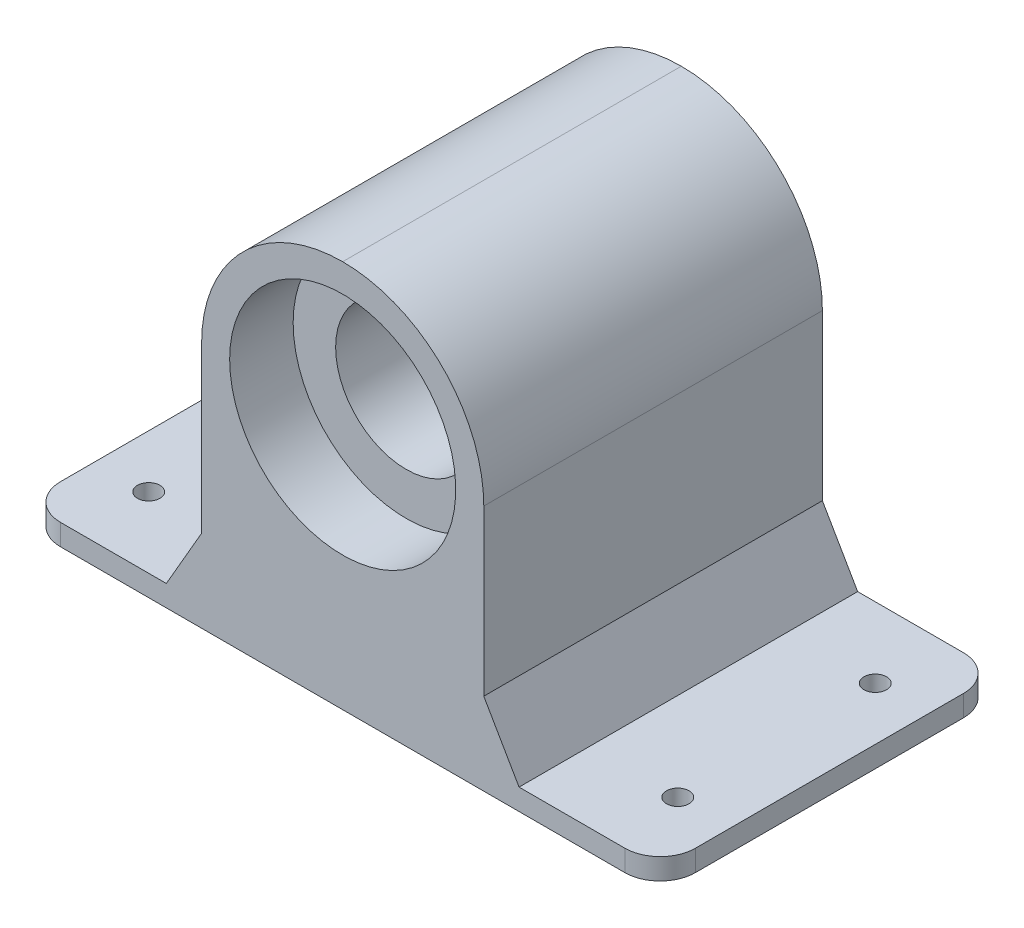
ISO-10303-21;
HEADER;
FILE_DESCRIPTION(('STEP AP214'),'2;1');
FILE_NAME('part.step','',(''),(''),'','','');
FILE_SCHEMA(('AUTOMOTIVE_DESIGN { 1 0 10303 214 1 1 1 1 }'));
ENDSEC;
DATA;
#1=APPLICATION_CONTEXT('core data for automotive mechanical design processes');
#2=APPLICATION_PROTOCOL_DEFINITION('international standard','automotive_design',2000,#1);
#3=PRODUCT_CONTEXT('',#1,'mechanical');
#4=PRODUCT('Part','Part','',(#3));
#5=PRODUCT_RELATED_PRODUCT_CATEGORY('part','',(#4));
#6=PRODUCT_DEFINITION_FORMATION('','',#4);
#7=PRODUCT_DEFINITION_CONTEXT('part definition',#1,'design');
#8=PRODUCT_DEFINITION('design','',#6,#7);
#9=PRODUCT_DEFINITION_SHAPE('','',#8);
#10=(LENGTH_UNIT() NAMED_UNIT(*) SI_UNIT(.MILLI.,.METRE.));
#11=(NAMED_UNIT(*) PLANE_ANGLE_UNIT() SI_UNIT($,.RADIAN.));
#12=(NAMED_UNIT(*) SI_UNIT($,.STERADIAN.) SOLID_ANGLE_UNIT());
#13=UNCERTAINTY_MEASURE_WITH_UNIT(LENGTH_MEASURE(1.E-05),#10,'distance_accuracy_value','');
#14=(GEOMETRIC_REPRESENTATION_CONTEXT(3) GLOBAL_UNCERTAINTY_ASSIGNED_CONTEXT((#13)) GLOBAL_UNIT_ASSIGNED_CONTEXT((#10,
#11,#12)) REPRESENTATION_CONTEXT('',''));
#15=CARTESIAN_POINT('',(0.,0.,0.));
#16=DIRECTION('',(0.,0.,1.));
#17=DIRECTION('',(1.,0.,0.));
#18=AXIS2_PLACEMENT_3D('',#15,#16,#17);
#19=CARTESIAN_POINT('',(20.,0.,24.));
#20=DIRECTION('',(-1.,0.,0.));
#21=DIRECTION('',(0.,0.,1.));
#22=AXIS2_PLACEMENT_3D('',#19,#20,#21);
#23=PLANE('',#22);
#24=DIRECTION('',(0.,1.,0.));
#25=VECTOR('',#24,1.);
#26=CARTESIAN_POINT('',(20.,0.,-24.));
#27=LINE('',#26,#25);
#28=CARTESIAN_POINT('',(20.,-23.3397459621555,-24.));
#29=VERTEX_POINT('',#28);
#30=CARTESIAN_POINT('',(20.,0.,-24.));
#31=VERTEX_POINT('',#30);
#32=EDGE_CURVE('E297',#29,#31,#27,.T.);
#33=ORIENTED_EDGE('',*,*,#32,.T.);
#34=DIRECTION('',(0.,0.,-1.));
#35=VECTOR('',#34,1.);
#36=CARTESIAN_POINT('',(20.,0.,24.));
#37=LINE('',#36,#35);
#38=CARTESIAN_POINT('',(20.,0.,24.));
#39=VERTEX_POINT('',#38);
#40=EDGE_CURVE('E208',#31,#39,#37,.F.);
#41=ORIENTED_EDGE('',*,*,#40,.T.);
#42=DIRECTION('',(0.,1.,0.));
#43=VECTOR('',#42,1.);
#44=CARTESIAN_POINT('',(20.,-35.,24.));
#45=LINE('',#44,#43);
#46=CARTESIAN_POINT('',(20.,-23.3397459621555,24.));
#47=VERTEX_POINT('',#46);
#48=EDGE_CURVE('E169',#47,#39,#45,.T.);
#49=ORIENTED_EDGE('',*,*,#48,.F.);
#50=DIRECTION('',(0.,0.,-1.));
#51=VECTOR('',#50,1.);
#52=CARTESIAN_POINT('',(20.,-23.3397459621555,-24.));
#53=LINE('',#52,#51);
#54=EDGE_CURVE('E182',#47,#29,#53,.T.);
#55=ORIENTED_EDGE('',*,*,#54,.T.);
#56=EDGE_LOOP('',(#33,#41,#49,#55));
#57=FACE_BOUND('',#56,.T.);
#58=ADVANCED_FACE('F34',(#57),#23,.F.);
#59=CARTESIAN_POINT('',(0.,0.,24.));
#60=DIRECTION('',(0.,0.,-1.));
#61=DIRECTION('',(-1.,0.,0.));
#62=AXIS2_PLACEMENT_3D('',#59,#60,#61);
#63=CYLINDRICAL_SURFACE('',#62,10.);
#64=CARTESIAN_POINT('',(0.,0.,-15.));
#65=DIRECTION('',(0.,0.,-1.));
#66=DIRECTION('',(-1.,0.,0.));
#67=AXIS2_PLACEMENT_3D('',#64,#65,#66);
#68=CIRCLE('',#67,10.);
#69=CARTESIAN_POINT('',(-10.,0.,-15.));
#70=VERTEX_POINT('',#69);
#71=EDGE_CURVE('E151',#70,#70,#68,.T.);
#72=ORIENTED_EDGE('',*,*,#71,.T.);
#73=EDGE_LOOP('',(#72));
#74=FACE_BOUND('',#73,.T.);
#75=CARTESIAN_POINT('',(0.,0.,15.));
#76=DIRECTION('',(0.,0.,1.));
#77=DIRECTION('',(1.,0.,0.));
#78=AXIS2_PLACEMENT_3D('',#75,#76,#77);
#79=CIRCLE('',#78,10.);
#80=CARTESIAN_POINT('',(10.,0.,15.));
#81=VERTEX_POINT('',#80);
#82=EDGE_CURVE('E177',#81,#81,#79,.T.);
#83=ORIENTED_EDGE('',*,*,#82,.T.);
#84=EDGE_LOOP('',(#83));
#85=FACE_BOUND('',#84,.T.);
#86=ADVANCED_FACE('F305',(#74,#85),#63,.F.);
#87=CARTESIAN_POINT('',(0.,0.,24.));
#88=DIRECTION('',(0.,0.,1.));
#89=DIRECTION('',(1.,0.,0.));
#90=AXIS2_PLACEMENT_3D('',#87,#88,#89);
#91=PLANE('',#90);
#92=CARTESIAN_POINT('',(0.,0.,24.));
#93=DIRECTION('',(0.,0.,-1.));
#94=DIRECTION('',(-1.,0.,0.));
#95=AXIS2_PLACEMENT_3D('',#92,#93,#94);
#96=CIRCLE('',#95,16.025);
#97=CARTESIAN_POINT('',(-16.025,0.,24.));
#98=VERTEX_POINT('',#97);
#99=EDGE_CURVE('E283',#98,#98,#96,.T.);
#100=ORIENTED_EDGE('',*,*,#99,.T.);
#101=EDGE_LOOP('',(#100));
#102=FACE_BOUND('',#101,.T.);
#103=DIRECTION('',(1.,0.,0.));
#104=VECTOR('',#103,1.);
#105=CARTESIAN_POINT('',(-20.,-35.,24.));
#106=LINE('',#105,#104);
#107=CARTESIAN_POINT('',(-40.,-35.,24.));
#108=VERTEX_POINT('',#107);
#109=CARTESIAN_POINT('',(40.,-35.,24.));
#110=VERTEX_POINT('',#109);
#111=EDGE_CURVE('E174',#108,#110,#106,.T.);
#112=ORIENTED_EDGE('',*,*,#111,.T.);
#113=DIRECTION('',(0.,-1.,0.));
#114=VECTOR('',#113,1.);
#115=CARTESIAN_POINT('',(40.,-32.,24.));
#116=LINE('',#115,#114);
#117=CARTESIAN_POINT('',(40.,-32.,24.));
#118=VERTEX_POINT('',#117);
#119=EDGE_CURVE('E237',#110,#118,#116,.F.);
#120=ORIENTED_EDGE('',*,*,#119,.T.);
#121=DIRECTION('',(-1.,0.,0.));
#122=VECTOR('',#121,1.);
#123=CARTESIAN_POINT('',(45.,-32.,24.));
#124=LINE('',#123,#122);
#125=CARTESIAN_POINT('',(25.,-32.,24.));
#126=VERTEX_POINT('',#125);
#127=EDGE_CURVE('E279',#118,#126,#124,.T.);
#128=ORIENTED_EDGE('',*,*,#127,.T.);
#129=DIRECTION('',(0.499999999999994,-0.866025403784442,0.));
#130=VECTOR('',#129,1.);
#131=CARTESIAN_POINT('',(25.,-32.,24.));
#132=LINE('',#131,#130);
#133=EDGE_CURVE('E162',#126,#47,#132,.F.);
#134=ORIENTED_EDGE('',*,*,#133,.T.);
#135=ORIENTED_EDGE('',*,*,#48,.T.);
#136=CARTESIAN_POINT('',(0.,0.,24.));
#137=DIRECTION('',(0.,0.,1.));
#138=DIRECTION('',(1.,0.,0.));
#139=AXIS2_PLACEMENT_3D('',#136,#137,#138);
#140=CIRCLE('',#139,20.);
#141=CARTESIAN_POINT('',(0.,20.,24.));
#142=VERTEX_POINT('',#141);
#143=EDGE_CURVE('E213',#39,#142,#140,.T.);
#144=ORIENTED_EDGE('',*,*,#143,.T.);
#145=CARTESIAN_POINT('',(0.,0.,24.));
#146=DIRECTION('',(0.,0.,1.));
#147=DIRECTION('',(1.,0.,0.));
#148=AXIS2_PLACEMENT_3D('',#145,#146,#147);
#149=CIRCLE('',#148,20.);
#150=CARTESIAN_POINT('',(-20.,0.,24.));
#151=VERTEX_POINT('',#150);
#152=EDGE_CURVE('E211',#142,#151,#149,.T.);
#153=ORIENTED_EDGE('',*,*,#152,.T.);
#154=DIRECTION('',(0.,-1.,0.));
#155=VECTOR('',#154,1.);
#156=CARTESIAN_POINT('',(-20.,0.,24.));
#157=LINE('',#156,#155);
#158=CARTESIAN_POINT('',(-20.,-23.3397459621555,24.));
#159=VERTEX_POINT('',#158);
#160=EDGE_CURVE('E295',#151,#159,#157,.T.);
#161=ORIENTED_EDGE('',*,*,#160,.T.);
#162=DIRECTION('',(-0.499999999999994,-0.866025403784442,0.));
#163=VECTOR('',#162,1.);
#164=CARTESIAN_POINT('',(-20.,-23.3397459621555,24.));
#165=LINE('',#164,#163);
#166=CARTESIAN_POINT('',(-25.,-32.,24.));
#167=VERTEX_POINT('',#166);
#168=EDGE_CURVE('E163',#159,#167,#165,.T.);
#169=ORIENTED_EDGE('',*,*,#168,.T.);
#170=DIRECTION('',(1.,0.,0.));
#171=VECTOR('',#170,1.);
#172=CARTESIAN_POINT('',(-45.,-32.,24.));
#173=LINE('',#172,#171);
#174=CARTESIAN_POINT('',(-40.,-32.,24.));
#175=VERTEX_POINT('',#174);
#176=EDGE_CURVE('E252',#175,#167,#173,.T.);
#177=ORIENTED_EDGE('',*,*,#176,.F.);
#178=DIRECTION('',(0.,-1.,0.));
#179=VECTOR('',#178,1.);
#180=CARTESIAN_POINT('',(-40.,-35.,24.));
#181=LINE('',#180,#179);
#182=EDGE_CURVE('E234',#175,#108,#181,.T.);
#183=ORIENTED_EDGE('',*,*,#182,.T.);
#184=EDGE_LOOP('',(#112,#120,#128,#134,#135,#144,#153,#161,#169,#177,#183));
#185=FACE_BOUND('',#184,.T.);
#186=ADVANCED_FACE('F257',(#102,#185),#91,.T.);
#187=CARTESIAN_POINT('',(0.,0.,-24.));
#188=DIRECTION('',(0.,0.,1.));
#189=DIRECTION('',(1.,0.,0.));
#190=AXIS2_PLACEMENT_3D('',#187,#188,#189);
#191=PLANE('',#190);
#192=CARTESIAN_POINT('',(0.,0.,-24.));
#193=DIRECTION('',(0.,0.,-1.));
#194=DIRECTION('',(-1.,0.,0.));
#195=AXIS2_PLACEMENT_3D('',#192,#193,#194);
#196=CIRCLE('',#195,16.025);
#197=CARTESIAN_POINT('',(-16.025,0.,-24.));
#198=VERTEX_POINT('',#197);
#199=EDGE_CURVE('E292',#198,#198,#196,.T.);
#200=ORIENTED_EDGE('',*,*,#199,.F.);
#201=EDGE_LOOP('',(#200));
#202=FACE_BOUND('',#201,.T.);
#203=DIRECTION('',(-1.,0.,0.));
#204=VECTOR('',#203,1.);
#205=CARTESIAN_POINT('',(45.,-32.,-24.));
#206=LINE('',#205,#204);
#207=CARTESIAN_POINT('',(40.,-32.,-24.));
#208=VERTEX_POINT('',#207);
#209=CARTESIAN_POINT('',(25.,-32.,-24.));
#210=VERTEX_POINT('',#209);
#211=EDGE_CURVE('E281',#208,#210,#206,.T.);
#212=ORIENTED_EDGE('',*,*,#211,.F.);
#213=DIRECTION('',(0.,1.,0.));
#214=VECTOR('',#213,1.);
#215=CARTESIAN_POINT('',(40.,0.,-24.));
#216=LINE('',#215,#214);
#217=CARTESIAN_POINT('',(40.,-35.,-24.));
#218=VERTEX_POINT('',#217);
#219=EDGE_CURVE('E245',#208,#218,#216,.F.);
#220=ORIENTED_EDGE('',*,*,#219,.T.);
#221=DIRECTION('',(1.,0.,0.));
#222=VECTOR('',#221,1.);
#223=CARTESIAN_POINT('',(-20.,-35.,-24.));
#224=LINE('',#223,#222);
#225=CARTESIAN_POINT('',(-40.,-35.,-24.));
#226=VERTEX_POINT('',#225);
#227=EDGE_CURVE('E150',#226,#218,#224,.T.);
#228=ORIENTED_EDGE('',*,*,#227,.F.);
#229=DIRECTION('',(0.,1.,0.));
#230=VECTOR('',#229,1.);
#231=CARTESIAN_POINT('',(-40.,0.,-24.));
#232=LINE('',#231,#230);
#233=CARTESIAN_POINT('',(-40.,-32.,-24.));
#234=VERTEX_POINT('',#233);
#235=EDGE_CURVE('E243',#226,#234,#232,.T.);
#236=ORIENTED_EDGE('',*,*,#235,.T.);
#237=DIRECTION('',(1.,0.,0.));
#238=VECTOR('',#237,1.);
#239=CARTESIAN_POINT('',(-45.,-32.,-24.));
#240=LINE('',#239,#238);
#241=CARTESIAN_POINT('',(-25.,-32.,-24.));
#242=VERTEX_POINT('',#241);
#243=EDGE_CURVE('E158',#234,#242,#240,.T.);
#244=ORIENTED_EDGE('',*,*,#243,.T.);
#245=DIRECTION('',(0.499999999999994,0.866025403784442,0.));
#246=VECTOR('',#245,1.);
#247=CARTESIAN_POINT('',(-4.89359353944923,2.82531754730558,-24.));
#248=LINE('',#247,#246);
#249=CARTESIAN_POINT('',(-20.,-23.3397459621555,-24.));
#250=VERTEX_POINT('',#249);
#251=EDGE_CURVE('E154',#242,#250,#248,.T.);
#252=ORIENTED_EDGE('',*,*,#251,.T.);
#253=DIRECTION('',(0.,-1.,0.));
#254=VECTOR('',#253,1.);
#255=CARTESIAN_POINT('',(-20.,-35.,-24.));
#256=LINE('',#255,#254);
#257=CARTESIAN_POINT('',(-20.,0.,-24.));
#258=VERTEX_POINT('',#257);
#259=EDGE_CURVE('E140',#258,#250,#256,.T.);
#260=ORIENTED_EDGE('',*,*,#259,.F.);
#261=CARTESIAN_POINT('',(0.,0.,-24.));
#262=DIRECTION('',(0.,0.,1.));
#263=DIRECTION('',(1.,0.,0.));
#264=AXIS2_PLACEMENT_3D('',#261,#262,#263);
#265=CIRCLE('',#264,20.);
#266=CARTESIAN_POINT('',(0.,20.,-24.));
#267=VERTEX_POINT('',#266);
#268=EDGE_CURVE('E189',#258,#267,#265,.F.);
#269=ORIENTED_EDGE('',*,*,#268,.T.);
#270=CARTESIAN_POINT('',(0.,0.,-24.));
#271=DIRECTION('',(0.,0.,1.));
#272=DIRECTION('',(1.,0.,0.));
#273=AXIS2_PLACEMENT_3D('',#270,#271,#272);
#274=CIRCLE('',#273,20.);
#275=EDGE_CURVE('E206',#267,#31,#274,.F.);
#276=ORIENTED_EDGE('',*,*,#275,.T.);
#277=ORIENTED_EDGE('',*,*,#32,.F.);
#278=DIRECTION('',(-0.499999999999994,0.866025403784442,0.));
#279=VECTOR('',#278,1.);
#280=CARTESIAN_POINT('',(4.89359353944923,2.82531754730558,-24.));
#281=LINE('',#280,#279);
#282=EDGE_CURVE('E186',#29,#210,#281,.F.);
#283=ORIENTED_EDGE('',*,*,#282,.T.);
#284=EDGE_LOOP('',(#212,#220,#228,#236,#244,#252,#260,#269,#276,#277,#283));
#285=FACE_BOUND('',#284,.T.);
#286=ADVANCED_FACE('F156',(#202,#285),#191,.F.);
#287=CARTESIAN_POINT('',(-20.,-35.,24.));
#288=DIRECTION('',(1.,0.,0.));
#289=DIRECTION('',(0.,0.,-1.));
#290=AXIS2_PLACEMENT_3D('',#287,#288,#289);
#291=PLANE('',#290);
#292=ORIENTED_EDGE('',*,*,#160,.F.);
#293=DIRECTION('',(0.,0.,-1.));
#294=VECTOR('',#293,1.);
#295=CARTESIAN_POINT('',(-20.,0.,24.));
#296=LINE('',#295,#294);
#297=EDGE_CURVE('E147',#151,#258,#296,.T.);
#298=ORIENTED_EDGE('',*,*,#297,.T.);
#299=ORIENTED_EDGE('',*,*,#259,.T.);
#300=DIRECTION('',(0.,0.,1.));
#301=VECTOR('',#300,1.);
#302=CARTESIAN_POINT('',(-20.,-23.3397459621555,24.));
#303=LINE('',#302,#301);
#304=EDGE_CURVE('E145',#250,#159,#303,.T.);
#305=ORIENTED_EDGE('',*,*,#304,.T.);
#306=EDGE_LOOP('',(#292,#298,#299,#305));
#307=FACE_BOUND('',#306,.T.);
#308=ADVANCED_FACE('F143',(#307),#291,.F.);
#309=CARTESIAN_POINT('',(-20.,-35.,24.));
#310=DIRECTION('',(0.,1.,0.));
#311=DIRECTION('',(0.,0.,1.));
#312=AXIS2_PLACEMENT_3D('',#309,#310,#311);
#313=PLANE('',#312);
#314=CARTESIAN_POINT('',(37.5,-35.,-14.));
#315=DIRECTION('',(0.,-1.,0.));
#316=DIRECTION('',(0.,0.,-1.));
#317=AXIS2_PLACEMENT_3D('',#314,#315,#316);
#318=CIRCLE('',#317,1.6);
#319=CARTESIAN_POINT('',(37.5,-35.,-15.6));
#320=VERTEX_POINT('',#319);
#321=EDGE_CURVE('E199',#320,#320,#318,.T.);
#322=ORIENTED_EDGE('',*,*,#321,.F.);
#323=EDGE_LOOP('',(#322));
#324=FACE_BOUND('',#323,.T.);
#325=CARTESIAN_POINT('',(-37.5,-35.,14.));
#326=DIRECTION('',(0.,-1.,0.));
#327=DIRECTION('',(0.,0.,1.));
#328=AXIS2_PLACEMENT_3D('',#325,#326,#327);
#329=CIRCLE('',#328,1.6);
#330=CARTESIAN_POINT('',(-37.5,-35.,15.6));
#331=VERTEX_POINT('',#330);
#332=EDGE_CURVE('E576',#331,#331,#329,.T.);
#333=ORIENTED_EDGE('',*,*,#332,.F.);
#334=EDGE_LOOP('',(#333));
#335=FACE_BOUND('',#334,.T.);
#336=CARTESIAN_POINT('',(-37.5,-35.,-14.));
#337=DIRECTION('',(0.,-1.,0.));
#338=DIRECTION('',(0.,0.,1.));
#339=AXIS2_PLACEMENT_3D('',#336,#337,#338);
#340=CIRCLE('',#339,1.6);
#341=CARTESIAN_POINT('',(-37.5,-35.,-12.4));
#342=VERTEX_POINT('',#341);
#343=EDGE_CURVE('E220',#342,#342,#340,.T.);
#344=ORIENTED_EDGE('',*,*,#343,.F.);
#345=EDGE_LOOP('',(#344));
#346=FACE_BOUND('',#345,.T.);
#347=CARTESIAN_POINT('',(37.5,-35.,14.));
#348=DIRECTION('',(0.,-1.,0.));
#349=DIRECTION('',(0.,0.,-1.));
#350=AXIS2_PLACEMENT_3D('',#347,#348,#349);
#351=CIRCLE('',#350,1.6);
#352=CARTESIAN_POINT('',(37.5,-35.,12.4));
#353=VERTEX_POINT('',#352);
#354=EDGE_CURVE('E194',#353,#353,#351,.T.);
#355=ORIENTED_EDGE('',*,*,#354,.F.);
#356=EDGE_LOOP('',(#355));
#357=FACE_BOUND('',#356,.T.);
#358=DIRECTION('',(0.,0.,-1.));
#359=VECTOR('',#358,1.);
#360=CARTESIAN_POINT('',(45.,-35.,24.));
#361=LINE('',#360,#359);
#362=CARTESIAN_POINT('',(45.,-35.,19.));
#363=VERTEX_POINT('',#362);
#364=CARTESIAN_POINT('',(45.,-35.,-19.));
#365=VERTEX_POINT('',#364);
#366=EDGE_CURVE('E259',#363,#365,#361,.T.);
#367=ORIENTED_EDGE('',*,*,#366,.F.);
#368=CARTESIAN_POINT('',(40.,-35.,19.));
#369=DIRECTION('',(0.,1.,0.));
#370=DIRECTION('',(0.,0.,1.));
#371=AXIS2_PLACEMENT_3D('',#368,#369,#370);
#372=CIRCLE('',#371,5.);
#373=EDGE_CURVE('E232',#363,#110,#372,.F.);
#374=ORIENTED_EDGE('',*,*,#373,.T.);
#375=ORIENTED_EDGE('',*,*,#111,.F.);
#376=CARTESIAN_POINT('',(-40.,-35.,19.));
#377=DIRECTION('',(0.,1.,0.));
#378=DIRECTION('',(0.,0.,1.));
#379=AXIS2_PLACEMENT_3D('',#376,#377,#378);
#380=CIRCLE('',#379,5.);
#381=CARTESIAN_POINT('',(-45.,-35.,19.));
#382=VERTEX_POINT('',#381);
#383=EDGE_CURVE('E226',#108,#382,#380,.F.);
#384=ORIENTED_EDGE('',*,*,#383,.T.);
#385=DIRECTION('',(0.,0.,-1.));
#386=VECTOR('',#385,1.);
#387=CARTESIAN_POINT('',(-45.,-35.,24.));
#388=LINE('',#387,#386);
#389=CARTESIAN_POINT('',(-45.,-35.,-19.));
#390=VERTEX_POINT('',#389);
#391=EDGE_CURVE('E265',#382,#390,#388,.T.);
#392=ORIENTED_EDGE('',*,*,#391,.T.);
#393=CARTESIAN_POINT('',(-40.,-35.,-19.));
#394=DIRECTION('',(0.,1.,0.));
#395=DIRECTION('',(0.,0.,1.));
#396=AXIS2_PLACEMENT_3D('',#393,#394,#395);
#397=CIRCLE('',#396,5.);
#398=EDGE_CURVE('E228',#390,#226,#397,.F.);
#399=ORIENTED_EDGE('',*,*,#398,.T.);
#400=ORIENTED_EDGE('',*,*,#227,.T.);
#401=CARTESIAN_POINT('',(40.,-35.,-19.));
#402=DIRECTION('',(0.,1.,0.));
#403=DIRECTION('',(0.,0.,1.));
#404=AXIS2_PLACEMENT_3D('',#401,#402,#403);
#405=CIRCLE('',#404,5.);
#406=EDGE_CURVE('E230',#218,#365,#405,.F.);
#407=ORIENTED_EDGE('',*,*,#406,.T.);
#408=EDGE_LOOP('',(#367,#374,#375,#384,#392,#399,#400,#407));
#409=FACE_BOUND('',#408,.T.);
#410=ADVANCED_FACE('F264',(#324,#335,#346,#357,#409),#313,.F.);
#411=CARTESIAN_POINT('',(0.,0.,-15.));
#412=DIRECTION('',(0.,0.,-1.));
#413=DIRECTION('',(-1.,0.,0.));
#414=AXIS2_PLACEMENT_3D('',#411,#412,#413);
#415=CYLINDRICAL_SURFACE('',#414,16.025);
#416=CARTESIAN_POINT('',(0.,0.,-15.));
#417=DIRECTION('',(0.,0.,-1.));
#418=DIRECTION('',(-1.,0.,0.));
#419=AXIS2_PLACEMENT_3D('',#416,#417,#418);
#420=CIRCLE('',#419,16.025);
#421=CARTESIAN_POINT('',(-16.025,0.,-15.));
#422=VERTEX_POINT('',#421);
#423=EDGE_CURVE('E289',#422,#422,#420,.T.);
#424=ORIENTED_EDGE('',*,*,#423,.F.);
#425=EDGE_LOOP('',(#424));
#426=FACE_BOUND('',#425,.T.);
#427=ORIENTED_EDGE('',*,*,#199,.T.);
#428=EDGE_LOOP('',(#427));
#429=FACE_BOUND('',#428,.T.);
#430=ADVANCED_FACE('F312',(#426,#429),#415,.F.);
#431=CARTESIAN_POINT('',(0.,0.,-15.));
#432=DIRECTION('',(0.,0.,-1.));
#433=DIRECTION('',(-1.,0.,0.));
#434=AXIS2_PLACEMENT_3D('',#431,#432,#433);
#435=PLANE('',#434);
#436=ORIENTED_EDGE('',*,*,#71,.F.);
#437=EDGE_LOOP('',(#436));
#438=FACE_BOUND('',#437,.T.);
#439=ORIENTED_EDGE('',*,*,#423,.T.);
#440=EDGE_LOOP('',(#439));
#441=FACE_BOUND('',#440,.T.);
#442=ADVANCED_FACE('F308',(#438,#441),#435,.T.);
#443=CARTESIAN_POINT('',(0.,0.,15.));
#444=DIRECTION('',(0.,0.,1.));
#445=DIRECTION('',(1.,0.,0.));
#446=AXIS2_PLACEMENT_3D('',#443,#444,#445);
#447=CYLINDRICAL_SURFACE('',#446,16.025);
#448=CARTESIAN_POINT('',(0.,0.,15.));
#449=DIRECTION('',(0.,0.,-1.));
#450=DIRECTION('',(-1.,0.,0.));
#451=AXIS2_PLACEMENT_3D('',#448,#449,#450);
#452=CIRCLE('',#451,16.025);
#453=CARTESIAN_POINT('',(-16.025,0.,15.));
#454=VERTEX_POINT('',#453);
#455=EDGE_CURVE('E284',#454,#454,#452,.T.);
#456=ORIENTED_EDGE('',*,*,#455,.T.);
#457=EDGE_LOOP('',(#456));
#458=FACE_BOUND('',#457,.T.);
#459=ORIENTED_EDGE('',*,*,#99,.F.);
#460=EDGE_LOOP('',(#459));
#461=FACE_BOUND('',#460,.T.);
#462=ADVANCED_FACE('F311',(#458,#461),#447,.F.);
#463=CARTESIAN_POINT('',(0.,0.,15.));
#464=DIRECTION('',(0.,0.,1.));
#465=DIRECTION('',(-1.,0.,0.));
#466=AXIS2_PLACEMENT_3D('',#463,#464,#465);
#467=PLANE('',#466);
#468=ORIENTED_EDGE('',*,*,#82,.F.);
#469=EDGE_LOOP('',(#468));
#470=FACE_BOUND('',#469,.T.);
#471=ORIENTED_EDGE('',*,*,#455,.F.);
#472=EDGE_LOOP('',(#471));
#473=FACE_BOUND('',#472,.T.);
#474=ADVANCED_FACE('F395',(#470,#473),#467,.T.);
#475=CARTESIAN_POINT('',(45.,-32.,24.));
#476=DIRECTION('',(0.,-1.,0.));
#477=DIRECTION('',(0.,0.,-1.));
#478=AXIS2_PLACEMENT_3D('',#475,#476,#477);
#479=PLANE('',#478);
#480=CARTESIAN_POINT('',(37.5,-32.,-14.));
#481=DIRECTION('',(0.,-1.,0.));
#482=DIRECTION('',(0.,0.,-1.));
#483=AXIS2_PLACEMENT_3D('',#480,#481,#482);
#484=CIRCLE('',#483,1.6);
#485=CARTESIAN_POINT('',(37.5,-32.,-15.6));
#486=VERTEX_POINT('',#485);
#487=EDGE_CURVE('E202',#486,#486,#484,.T.);
#488=ORIENTED_EDGE('',*,*,#487,.T.);
#489=EDGE_LOOP('',(#488));
#490=FACE_BOUND('',#489,.T.);
#491=CARTESIAN_POINT('',(37.5,-32.,14.));
#492=DIRECTION('',(0.,-1.,0.));
#493=DIRECTION('',(0.,0.,-1.));
#494=AXIS2_PLACEMENT_3D('',#491,#492,#493);
#495=CIRCLE('',#494,1.6);
#496=CARTESIAN_POINT('',(37.5,-32.,12.4));
#497=VERTEX_POINT('',#496);
#498=EDGE_CURVE('E190',#497,#497,#495,.T.);
#499=ORIENTED_EDGE('',*,*,#498,.T.);
#500=EDGE_LOOP('',(#499));
#501=FACE_BOUND('',#500,.T.);
#502=ORIENTED_EDGE('',*,*,#127,.F.);
#503=CARTESIAN_POINT('',(40.,-32.,19.));
#504=DIRECTION('',(0.,-1.,0.));
#505=DIRECTION('',(0.,0.,-1.));
#506=AXIS2_PLACEMENT_3D('',#503,#504,#505);
#507=CIRCLE('',#506,5.);
#508=CARTESIAN_POINT('',(45.,-32.,19.));
#509=VERTEX_POINT('',#508);
#510=EDGE_CURVE('E241',#118,#509,#507,.F.);
#511=ORIENTED_EDGE('',*,*,#510,.T.);
#512=DIRECTION('',(0.,0.,1.));
#513=VECTOR('',#512,1.);
#514=CARTESIAN_POINT('',(45.,-32.,24.));
#515=LINE('',#514,#513);
#516=CARTESIAN_POINT('',(45.,-32.,-19.));
#517=VERTEX_POINT('',#516);
#518=EDGE_CURVE('E276',#517,#509,#515,.T.);
#519=ORIENTED_EDGE('',*,*,#518,.F.);
#520=CARTESIAN_POINT('',(40.,-32.,-19.));
#521=DIRECTION('',(0.,-1.,0.));
#522=DIRECTION('',(0.,0.,-1.));
#523=AXIS2_PLACEMENT_3D('',#520,#521,#522);
#524=CIRCLE('',#523,5.);
#525=EDGE_CURVE('E239',#517,#208,#524,.F.);
#526=ORIENTED_EDGE('',*,*,#525,.T.);
#527=ORIENTED_EDGE('',*,*,#211,.T.);
#528=DIRECTION('',(0.,0.,1.));
#529=VECTOR('',#528,1.);
#530=CARTESIAN_POINT('',(25.,-32.,24.));
#531=LINE('',#530,#529);
#532=EDGE_CURVE('E171',#210,#126,#531,.T.);
#533=ORIENTED_EDGE('',*,*,#532,.T.);
#534=EDGE_LOOP('',(#502,#511,#519,#526,#527,#533));
#535=FACE_BOUND('',#534,.T.);
#536=ADVANCED_FACE('F384',(#490,#501,#535),#479,.F.);
#537=CARTESIAN_POINT('',(45.,0.,0.));
#538=DIRECTION('',(-1.,0.,0.));
#539=DIRECTION('',(0.,0.,1.));
#540=AXIS2_PLACEMENT_3D('',#537,#538,#539);
#541=PLANE('',#540);
#542=ORIENTED_EDGE('',*,*,#518,.T.);
#543=DIRECTION('',(0.,-1.,0.));
#544=VECTOR('',#543,1.);
#545=CARTESIAN_POINT('',(45.,-35.,19.));
#546=LINE('',#545,#544);
#547=EDGE_CURVE('E223',#509,#363,#546,.T.);
#548=ORIENTED_EDGE('',*,*,#547,.T.);
#549=ORIENTED_EDGE('',*,*,#366,.T.);
#550=DIRECTION('',(0.,1.,0.));
#551=VECTOR('',#550,1.);
#552=CARTESIAN_POINT('',(45.,0.,-19.));
#553=LINE('',#552,#551);
#554=EDGE_CURVE('E216',#365,#517,#553,.T.);
#555=ORIENTED_EDGE('',*,*,#554,.T.);
#556=EDGE_LOOP('',(#542,#548,#549,#555));
#557=FACE_BOUND('',#556,.T.);
#558=ADVANCED_FACE('F376',(#557),#541,.F.);
#559=CARTESIAN_POINT('',(-45.,-32.,24.));
#560=DIRECTION('',(0.,1.,0.));
#561=DIRECTION('',(0.,0.,1.));
#562=AXIS2_PLACEMENT_3D('',#559,#560,#561);
#563=PLANE('',#562);
#564=CARTESIAN_POINT('',(-37.5,-32.,14.));
#565=DIRECTION('',(0.,1.,0.));
#566=DIRECTION('',(0.,0.,1.));
#567=AXIS2_PLACEMENT_3D('',#564,#565,#566);
#568=CIRCLE('',#567,1.6);
#569=CARTESIAN_POINT('',(-37.5,-32.,15.6));
#570=VERTEX_POINT('',#569);
#571=EDGE_CURVE('E198',#570,#570,#568,.T.);
#572=ORIENTED_EDGE('',*,*,#571,.F.);
#573=EDGE_LOOP('',(#572));
#574=FACE_BOUND('',#573,.T.);
#575=CARTESIAN_POINT('',(-37.5,-32.,-14.));
#576=DIRECTION('',(0.,1.,0.));
#577=DIRECTION('',(0.,0.,1.));
#578=AXIS2_PLACEMENT_3D('',#575,#576,#577);
#579=CIRCLE('',#578,1.6);
#580=CARTESIAN_POINT('',(-37.5,-32.,-12.4));
#581=VERTEX_POINT('',#580);
#582=EDGE_CURVE('E195',#581,#581,#579,.T.);
#583=ORIENTED_EDGE('',*,*,#582,.F.);
#584=EDGE_LOOP('',(#583));
#585=FACE_BOUND('',#584,.T.);
#586=ORIENTED_EDGE('',*,*,#243,.F.);
#587=CARTESIAN_POINT('',(-40.,-32.,-19.));
#588=DIRECTION('',(0.,1.,0.));
#589=DIRECTION('',(0.,0.,1.));
#590=AXIS2_PLACEMENT_3D('',#587,#588,#589);
#591=CIRCLE('',#590,5.);
#592=CARTESIAN_POINT('',(-45.,-32.,-19.));
#593=VERTEX_POINT('',#592);
#594=EDGE_CURVE('E55',#234,#593,#591,.T.);
#595=ORIENTED_EDGE('',*,*,#594,.T.);
#596=DIRECTION('',(0.,0.,1.));
#597=VECTOR('',#596,1.);
#598=CARTESIAN_POINT('',(-45.,-32.,24.));
#599=LINE('',#598,#597);
#600=CARTESIAN_POINT('',(-45.,-32.,19.));
#601=VERTEX_POINT('',#600);
#602=EDGE_CURVE('E193',#593,#601,#599,.T.);
#603=ORIENTED_EDGE('',*,*,#602,.T.);
#604=CARTESIAN_POINT('',(-40.,-32.,19.));
#605=DIRECTION('',(0.,1.,0.));
#606=DIRECTION('',(0.,0.,1.));
#607=AXIS2_PLACEMENT_3D('',#604,#605,#606);
#608=CIRCLE('',#607,5.);
#609=EDGE_CURVE('E247',#601,#175,#608,.T.);
#610=ORIENTED_EDGE('',*,*,#609,.T.);
#611=ORIENTED_EDGE('',*,*,#176,.T.);
#612=DIRECTION('',(0.,0.,-1.));
#613=VECTOR('',#612,1.);
#614=CARTESIAN_POINT('',(-25.,-32.,24.));
#615=LINE('',#614,#613);
#616=EDGE_CURVE('E168',#167,#242,#615,.T.);
#617=ORIENTED_EDGE('',*,*,#616,.T.);
#618=EDGE_LOOP('',(#586,#595,#603,#610,#611,#617));
#619=FACE_BOUND('',#618,.T.);
#620=ADVANCED_FACE('F251',(#574,#585,#619),#563,.T.);
#621=CARTESIAN_POINT('',(-45.,0.,0.));
#622=DIRECTION('',(1.,0.,0.));
#623=DIRECTION('',(0.,0.,1.));
#624=AXIS2_PLACEMENT_3D('',#621,#622,#623);
#625=PLANE('',#624);
#626=ORIENTED_EDGE('',*,*,#602,.F.);
#627=DIRECTION('',(0.,1.,0.));
#628=VECTOR('',#627,1.);
#629=CARTESIAN_POINT('',(-45.,0.,-19.));
#630=LINE('',#629,#628);
#631=EDGE_CURVE('E11',#593,#390,#630,.F.);
#632=ORIENTED_EDGE('',*,*,#631,.T.);
#633=ORIENTED_EDGE('',*,*,#391,.F.);
#634=DIRECTION('',(0.,-1.,0.));
#635=VECTOR('',#634,1.);
#636=CARTESIAN_POINT('',(-45.,-32.,19.));
#637=LINE('',#636,#635);
#638=EDGE_CURVE('E42',#382,#601,#637,.F.);
#639=ORIENTED_EDGE('',*,*,#638,.T.);
#640=EDGE_LOOP('',(#626,#632,#633,#639));
#641=FACE_BOUND('',#640,.T.);
#642=ADVANCED_FACE('F267',(#641),#625,.F.);
#643=CARTESIAN_POINT('',(-20.,-23.3397459621555,24.));
#644=DIRECTION('',(0.866025403784442,-0.499999999999994,0.));
#645=DIRECTION('',(0.,0.,1.));
#646=AXIS2_PLACEMENT_3D('',#643,#644,#645);
#647=PLANE('',#646);
#648=ORIENTED_EDGE('',*,*,#251,.F.);
#649=ORIENTED_EDGE('',*,*,#616,.F.);
#650=ORIENTED_EDGE('',*,*,#168,.F.);
#651=ORIENTED_EDGE('',*,*,#304,.F.);
#652=EDGE_LOOP('',(#648,#649,#650,#651));
#653=FACE_BOUND('',#652,.T.);
#654=ADVANCED_FACE('F166',(#653),#647,.F.);
#655=CARTESIAN_POINT('',(25.,-32.,24.));
#656=DIRECTION('',(0.866025403784442,0.499999999999994,0.));
#657=DIRECTION('',(0.,0.,-1.));
#658=AXIS2_PLACEMENT_3D('',#655,#656,#657);
#659=PLANE('',#658);
#660=ORIENTED_EDGE('',*,*,#282,.F.);
#661=ORIENTED_EDGE('',*,*,#54,.F.);
#662=ORIENTED_EDGE('',*,*,#133,.F.);
#663=ORIENTED_EDGE('',*,*,#532,.F.);
#664=EDGE_LOOP('',(#660,#661,#662,#663));
#665=FACE_BOUND('',#664,.T.);
#666=ADVANCED_FACE('F343',(#665),#659,.T.);
#667=CARTESIAN_POINT('',(37.5,20.,14.));
#668=DIRECTION('',(0.,-1.,0.));
#669=DIRECTION('',(0.,0.,-1.));
#670=AXIS2_PLACEMENT_3D('',#667,#668,#669);
#671=CYLINDRICAL_SURFACE('',#670,1.6);
#672=ORIENTED_EDGE('',*,*,#354,.T.);
#673=EDGE_LOOP('',(#672));
#674=FACE_BOUND('',#673,.T.);
#675=ORIENTED_EDGE('',*,*,#498,.F.);
#676=EDGE_LOOP('',(#675));
#677=FACE_BOUND('',#676,.T.);
#678=ADVANCED_FACE('F346',(#674,#677),#671,.F.);
#679=CARTESIAN_POINT('',(-37.5,20.,-14.));
#680=DIRECTION('',(0.,-1.,0.));
#681=DIRECTION('',(0.,0.,-1.));
#682=AXIS2_PLACEMENT_3D('',#679,#680,#681);
#683=CYLINDRICAL_SURFACE('',#682,1.6);
#684=ORIENTED_EDGE('',*,*,#582,.T.);
#685=EDGE_LOOP('',(#684));
#686=FACE_BOUND('',#685,.T.);
#687=ORIENTED_EDGE('',*,*,#343,.T.);
#688=EDGE_LOOP('',(#687));
#689=FACE_BOUND('',#688,.T.);
#690=ADVANCED_FACE('F447',(#686,#689),#683,.F.);
#691=CARTESIAN_POINT('',(-37.5,20.,14.));
#692=DIRECTION('',(0.,-1.,0.));
#693=DIRECTION('',(0.,0.,-1.));
#694=AXIS2_PLACEMENT_3D('',#691,#692,#693);
#695=CYLINDRICAL_SURFACE('',#694,1.6);
#696=ORIENTED_EDGE('',*,*,#571,.T.);
#697=EDGE_LOOP('',(#696));
#698=FACE_BOUND('',#697,.T.);
#699=ORIENTED_EDGE('',*,*,#332,.T.);
#700=EDGE_LOOP('',(#699));
#701=FACE_BOUND('',#700,.T.);
#702=ADVANCED_FACE('F457',(#698,#701),#695,.F.);
#703=CARTESIAN_POINT('',(37.5,20.,-14.));
#704=DIRECTION('',(0.,-1.,0.));
#705=DIRECTION('',(0.,0.,-1.));
#706=AXIS2_PLACEMENT_3D('',#703,#704,#705);
#707=CYLINDRICAL_SURFACE('',#706,1.6);
#708=ORIENTED_EDGE('',*,*,#321,.T.);
#709=EDGE_LOOP('',(#708));
#710=FACE_BOUND('',#709,.T.);
#711=ORIENTED_EDGE('',*,*,#487,.F.);
#712=EDGE_LOOP('',(#711));
#713=FACE_BOUND('',#712,.T.);
#714=ADVANCED_FACE('F356',(#710,#713),#707,.F.);
#715=CARTESIAN_POINT('',(0.,0.,24.));
#716=DIRECTION('',(0.,0.,-1.));
#717=DIRECTION('',(-1.,0.,0.));
#718=AXIS2_PLACEMENT_3D('',#715,#716,#717);
#719=CYLINDRICAL_SURFACE('',#718,20.);
#720=ORIENTED_EDGE('',*,*,#297,.F.);
#721=ORIENTED_EDGE('',*,*,#152,.F.);
#722=DIRECTION('',(0.,0.,-1.));
#723=VECTOR('',#722,1.);
#724=CARTESIAN_POINT('',(0.,20.,24.));
#725=LINE('',#724,#723);
#726=EDGE_CURVE('E217',#267,#142,#725,.F.);
#727=ORIENTED_EDGE('',*,*,#726,.F.);
#728=ORIENTED_EDGE('',*,*,#268,.F.);
#729=EDGE_LOOP('',(#720,#721,#727,#728));
#730=FACE_BOUND('',#729,.T.);
#731=ADVANCED_FACE('F352',(#730),#719,.T.);
#732=CARTESIAN_POINT('',(0.,0.,24.));
#733=DIRECTION('',(0.,0.,-1.));
#734=DIRECTION('',(-1.,0.,0.));
#735=AXIS2_PLACEMENT_3D('',#732,#733,#734);
#736=CYLINDRICAL_SURFACE('',#735,20.);
#737=ORIENTED_EDGE('',*,*,#143,.F.);
#738=ORIENTED_EDGE('',*,*,#40,.F.);
#739=ORIENTED_EDGE('',*,*,#275,.F.);
#740=ORIENTED_EDGE('',*,*,#726,.T.);
#741=EDGE_LOOP('',(#737,#738,#739,#740));
#742=FACE_BOUND('',#741,.T.);
#743=ADVANCED_FACE('F348',(#742),#736,.T.);
#744=CARTESIAN_POINT('',(40.,0.,19.));
#745=DIRECTION('',(0.,1.,0.));
#746=DIRECTION('',(0.,0.,1.));
#747=AXIS2_PLACEMENT_3D('',#744,#745,#746);
#748=CYLINDRICAL_SURFACE('',#747,5.);
#749=ORIENTED_EDGE('',*,*,#510,.F.);
#750=ORIENTED_EDGE('',*,*,#119,.F.);
#751=ORIENTED_EDGE('',*,*,#373,.F.);
#752=ORIENTED_EDGE('',*,*,#547,.F.);
#753=EDGE_LOOP('',(#749,#750,#751,#752));
#754=FACE_BOUND('',#753,.T.);
#755=ADVANCED_FACE('F351',(#754),#748,.T.);
#756=CARTESIAN_POINT('',(40.,0.,-19.));
#757=DIRECTION('',(0.,1.,0.));
#758=DIRECTION('',(0.,0.,1.));
#759=AXIS2_PLACEMENT_3D('',#756,#757,#758);
#760=CYLINDRICAL_SURFACE('',#759,5.);
#761=ORIENTED_EDGE('',*,*,#406,.F.);
#762=ORIENTED_EDGE('',*,*,#219,.F.);
#763=ORIENTED_EDGE('',*,*,#525,.F.);
#764=ORIENTED_EDGE('',*,*,#554,.F.);
#765=EDGE_LOOP('',(#761,#762,#763,#764));
#766=FACE_BOUND('',#765,.T.);
#767=ADVANCED_FACE('F360',(#766),#760,.T.);
#768=CARTESIAN_POINT('',(-40.,0.,-19.));
#769=DIRECTION('',(0.,1.,0.));
#770=DIRECTION('',(0.,0.,1.));
#771=AXIS2_PLACEMENT_3D('',#768,#769,#770);
#772=CYLINDRICAL_SURFACE('',#771,5.);
#773=ORIENTED_EDGE('',*,*,#398,.F.);
#774=ORIENTED_EDGE('',*,*,#631,.F.);
#775=ORIENTED_EDGE('',*,*,#594,.F.);
#776=ORIENTED_EDGE('',*,*,#235,.F.);
#777=EDGE_LOOP('',(#773,#774,#775,#776));
#778=FACE_BOUND('',#777,.T.);
#779=ADVANCED_FACE('F363',(#778),#772,.T.);
#780=CARTESIAN_POINT('',(-40.,0.,19.));
#781=DIRECTION('',(0.,1.,0.));
#782=DIRECTION('',(0.,0.,1.));
#783=AXIS2_PLACEMENT_3D('',#780,#781,#782);
#784=CYLINDRICAL_SURFACE('',#783,5.);
#785=ORIENTED_EDGE('',*,*,#609,.F.);
#786=ORIENTED_EDGE('',*,*,#638,.F.);
#787=ORIENTED_EDGE('',*,*,#383,.F.);
#788=ORIENTED_EDGE('',*,*,#182,.F.);
#789=EDGE_LOOP('',(#785,#786,#787,#788));
#790=FACE_BOUND('',#789,.T.);
#791=ADVANCED_FACE('F36',(#790),#784,.T.);
#792=CLOSED_SHELL('',(#58,#86,#186,#286,#308,#410,#430,#442,#462,#474,#536,#558,#620,#642,#654,
#666,#678,#690,#702,#714,#731,#743,#755,#767,#779,#791));
#793=MANIFOLD_SOLID_BREP('B2',#792);
#794=ADVANCED_BREP_SHAPE_REPRESENTATION('',(#18,#793),#14);
#795=SHAPE_DEFINITION_REPRESENTATION(#9,#794);
ENDSEC;
END-ISO-10303-21;
